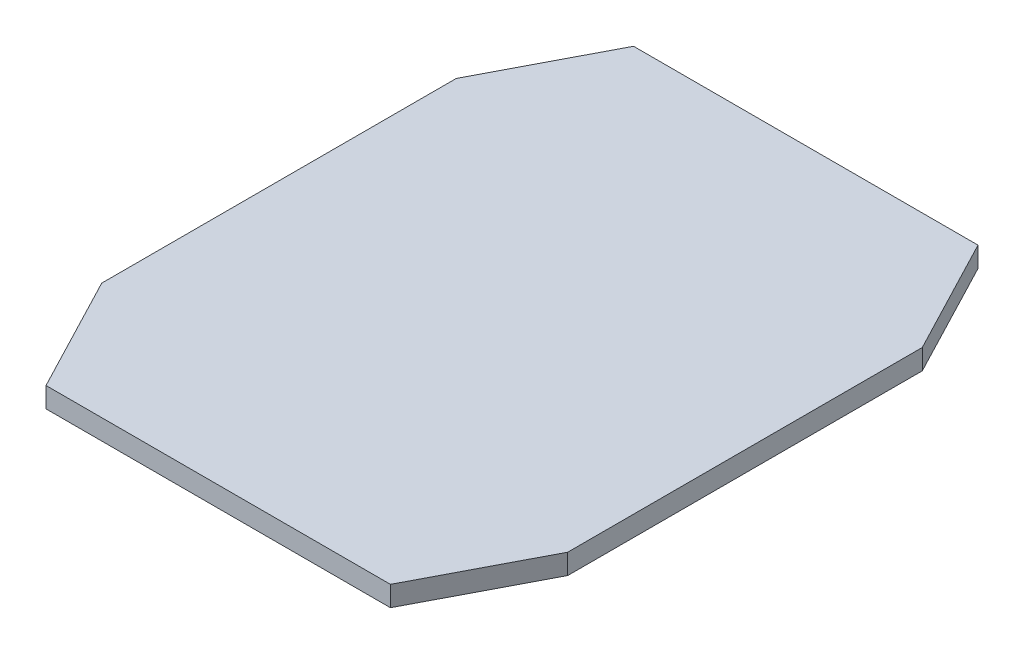
ISO-10303-21;
HEADER;
FILE_DESCRIPTION(('STEP AP214'),'2;1');
FILE_NAME('part.step','',(''),(''),'','','');
FILE_SCHEMA(('AUTOMOTIVE_DESIGN { 1 0 10303 214 1 1 1 1 }'));
ENDSEC;
DATA;
#1=APPLICATION_CONTEXT('core data for automotive mechanical design processes');
#2=APPLICATION_PROTOCOL_DEFINITION('international standard','automotive_design',2000,#1);
#3=PRODUCT_CONTEXT('',#1,'mechanical');
#4=PRODUCT('Part','Part','',(#3));
#5=PRODUCT_RELATED_PRODUCT_CATEGORY('part','',(#4));
#6=PRODUCT_DEFINITION_FORMATION('','',#4);
#7=PRODUCT_DEFINITION_CONTEXT('part definition',#1,'design');
#8=PRODUCT_DEFINITION('design','',#6,#7);
#9=PRODUCT_DEFINITION_SHAPE('','',#8);
#10=(LENGTH_UNIT() NAMED_UNIT(*) SI_UNIT(.MILLI.,.METRE.));
#11=(NAMED_UNIT(*) PLANE_ANGLE_UNIT() SI_UNIT($,.RADIAN.));
#12=(NAMED_UNIT(*) SI_UNIT($,.STERADIAN.) SOLID_ANGLE_UNIT());
#13=UNCERTAINTY_MEASURE_WITH_UNIT(LENGTH_MEASURE(1.E-05),#10,'distance_accuracy_value','');
#14=(GEOMETRIC_REPRESENTATION_CONTEXT(3) GLOBAL_UNCERTAINTY_ASSIGNED_CONTEXT((#13)) GLOBAL_UNIT_ASSIGNED_CONTEXT((#10,
#11,#12)) REPRESENTATION_CONTEXT('',''));
#15=CARTESIAN_POINT('',(0.,0.,0.));
#16=DIRECTION('',(0.,0.,1.));
#17=DIRECTION('',(1.,0.,0.));
#18=AXIS2_PLACEMENT_3D('',#15,#16,#17);
#19=CARTESIAN_POINT('',(-155.,10.,-145.));
#20=DIRECTION('',(0.,0.,1.));
#21=DIRECTION('',(1.,0.,0.));
#22=AXIS2_PLACEMENT_3D('',#19,#20,#21);
#23=PLANE('',#22);
#24=DIRECTION('',(-1.,0.,0.));
#25=VECTOR('',#24,1.);
#26=CARTESIAN_POINT('',(-155.,0.,-145.));
#27=LINE('',#26,#25);
#28=CARTESIAN_POINT('',(85.0000000049335,0.,-145.));
#29=VERTEX_POINT('',#28);
#30=CARTESIAN_POINT('',(-85.0000000049335,0.,-145.));
#31=VERTEX_POINT('',#30);
#32=EDGE_CURVE('E123',#29,#31,#27,.T.);
#33=ORIENTED_EDGE('',*,*,#32,.T.);
#34=DIRECTION('',(0.,1.,0.));
#35=VECTOR('',#34,1.);
#36=CARTESIAN_POINT('',(-85.0000000049335,0.,-145.));
#37=LINE('',#36,#35);
#38=CARTESIAN_POINT('',(-85.0000000049335,10.,-145.));
#39=VERTEX_POINT('',#38);
#40=EDGE_CURVE('E128',#31,#39,#37,.T.);
#41=ORIENTED_EDGE('',*,*,#40,.T.);
#42=DIRECTION('',(-1.,0.,0.));
#43=VECTOR('',#42,1.);
#44=CARTESIAN_POINT('',(-155.,10.,-145.));
#45=LINE('',#44,#43);
#46=CARTESIAN_POINT('',(85.0000000049335,10.,-145.));
#47=VERTEX_POINT('',#46);
#48=EDGE_CURVE('E46',#47,#39,#45,.T.);
#49=ORIENTED_EDGE('',*,*,#48,.F.);
#50=DIRECTION('',(0.,1.,0.));
#51=VECTOR('',#50,1.);
#52=CARTESIAN_POINT('',(85.0000000049335,0.,-145.));
#53=LINE('',#52,#51);
#54=EDGE_CURVE('E144',#29,#47,#53,.T.);
#55=ORIENTED_EDGE('',*,*,#54,.F.);
#56=EDGE_LOOP('',(#33,#41,#49,#55));
#57=FACE_BOUND('',#56,.T.);
#58=ADVANCED_FACE('F36',(#57),#23,.F.);
#59=CARTESIAN_POINT('',(-155.,10.,145.));
#60=DIRECTION('',(0.,0.,-1.));
#61=DIRECTION('',(-1.,0.,0.));
#62=AXIS2_PLACEMENT_3D('',#59,#60,#61);
#63=PLANE('',#62);
#64=DIRECTION('',(0.,1.,0.));
#65=VECTOR('',#64,1.);
#66=CARTESIAN_POINT('',(-85.,0.,145.));
#67=LINE('',#66,#65);
#68=CARTESIAN_POINT('',(-85.,0.,145.));
#69=VERTEX_POINT('',#68);
#70=CARTESIAN_POINT('',(-85.,10.,145.));
#71=VERTEX_POINT('',#70);
#72=EDGE_CURVE('E110',#69,#71,#67,.T.);
#73=ORIENTED_EDGE('',*,*,#72,.F.);
#74=DIRECTION('',(1.,0.,0.));
#75=VECTOR('',#74,1.);
#76=CARTESIAN_POINT('',(-155.,0.,145.));
#77=LINE('',#76,#75);
#78=CARTESIAN_POINT('',(85.,0.,145.));
#79=VERTEX_POINT('',#78);
#80=EDGE_CURVE('E41',#69,#79,#77,.T.);
#81=ORIENTED_EDGE('',*,*,#80,.T.);
#82=DIRECTION('',(0.,1.,0.));
#83=VECTOR('',#82,1.);
#84=CARTESIAN_POINT('',(85.,0.,145.));
#85=LINE('',#84,#83);
#86=CARTESIAN_POINT('',(85.,10.,145.));
#87=VERTEX_POINT('',#86);
#88=EDGE_CURVE('E152',#79,#87,#85,.T.);
#89=ORIENTED_EDGE('',*,*,#88,.T.);
#90=DIRECTION('',(1.,0.,0.));
#91=VECTOR('',#90,1.);
#92=CARTESIAN_POINT('',(-155.,10.,145.));
#93=LINE('',#92,#91);
#94=EDGE_CURVE('E11',#71,#87,#93,.T.);
#95=ORIENTED_EDGE('',*,*,#94,.F.);
#96=EDGE_LOOP('',(#73,#81,#89,#95));
#97=FACE_BOUND('',#96,.T.);
#98=ADVANCED_FACE('F119',(#97),#63,.F.);
#99=CARTESIAN_POINT('',(0.,10.,0.));
#100=DIRECTION('',(0.,1.,0.));
#101=DIRECTION('',(0.,0.,1.));
#102=AXIS2_PLACEMENT_3D('',#99,#100,#101);
#103=PLANE('',#102);
#104=DIRECTION('',(-0.462566006774816,0.,-0.886584846123822));
#105=VECTOR('',#104,1.);
#106=CARTESIAN_POINT('',(-115.000000005912,10.,87.5000000012872));
#107=LINE('',#106,#105);
#108=CARTESIAN_POINT('',(-115.000000005912,10.,87.5000000012872));
#109=VERTEX_POINT('',#108);
#110=EDGE_CURVE('E150',#71,#109,#107,.T.);
#111=ORIENTED_EDGE('',*,*,#110,.F.);
#112=ORIENTED_EDGE('',*,*,#94,.T.);
#113=DIRECTION('',(-0.462566006774816,0.,0.886584846123822));
#114=VECTOR('',#113,1.);
#115=CARTESIAN_POINT('',(115.000000005912,10.,87.5000000012872));
#116=LINE('',#115,#114);
#117=CARTESIAN_POINT('',(115.000000005912,10.,87.5000000012872));
#118=VERTEX_POINT('',#117);
#119=EDGE_CURVE('E139',#118,#87,#116,.T.);
#120=ORIENTED_EDGE('',*,*,#119,.F.);
#121=DIRECTION('',(0.,0.,1.));
#122=VECTOR('',#121,1.);
#123=CARTESIAN_POINT('',(115.000000005912,10.,-87.4999999987128));
#124=LINE('',#123,#122);
#125=CARTESIAN_POINT('',(115.000000005912,10.,-87.4999999987128));
#126=VERTEX_POINT('',#125);
#127=EDGE_CURVE('E148',#126,#118,#124,.T.);
#128=ORIENTED_EDGE('',*,*,#127,.F.);
#129=DIRECTION('',(0.462566006698744,0.,0.886584846163511));
#130=VECTOR('',#129,1.);
#131=CARTESIAN_POINT('',(85.0000000049335,10.,-145.));
#132=LINE('',#131,#130);
#133=EDGE_CURVE('E143',#47,#126,#132,.T.);
#134=ORIENTED_EDGE('',*,*,#133,.F.);
#135=ORIENTED_EDGE('',*,*,#48,.T.);
#136=DIRECTION('',(0.462566006698744,0.,-0.886584846163511));
#137=VECTOR('',#136,1.);
#138=CARTESIAN_POINT('',(-85.0000000049335,10.,-145.));
#139=LINE('',#138,#137);
#140=CARTESIAN_POINT('',(-115.000000005912,10.,-87.4999999987128));
#141=VERTEX_POINT('',#140);
#142=EDGE_CURVE('E114',#141,#39,#139,.T.);
#143=ORIENTED_EDGE('',*,*,#142,.F.);
#144=DIRECTION('',(0.,0.,-1.));
#145=VECTOR('',#144,1.);
#146=CARTESIAN_POINT('',(-115.000000005912,10.,-87.4999999987128));
#147=LINE('',#146,#145);
#148=EDGE_CURVE('E161',#109,#141,#147,.T.);
#149=ORIENTED_EDGE('',*,*,#148,.F.);
#150=EDGE_LOOP('',(#111,#112,#120,#128,#134,#135,#143,#149));
#151=FACE_BOUND('',#150,.T.);
#152=ADVANCED_FACE('F176',(#151),#103,.T.);
#153=CARTESIAN_POINT('',(0.,0.,0.));
#154=DIRECTION('',(0.,1.,0.));
#155=DIRECTION('',(0.,0.,1.));
#156=AXIS2_PLACEMENT_3D('',#153,#154,#155);
#157=PLANE('',#156);
#158=DIRECTION('',(0.,0.,-1.));
#159=VECTOR('',#158,1.);
#160=CARTESIAN_POINT('',(-115.000000005912,0.,-87.4999999987128));
#161=LINE('',#160,#159);
#162=CARTESIAN_POINT('',(-115.000000005912,0.,87.5000000012872));
#163=VERTEX_POINT('',#162);
#164=CARTESIAN_POINT('',(-115.000000005912,0.,-87.4999999987128));
#165=VERTEX_POINT('',#164);
#166=EDGE_CURVE('E112',#163,#165,#161,.T.);
#167=ORIENTED_EDGE('',*,*,#166,.T.);
#168=DIRECTION('',(0.462566006698744,0.,-0.886584846163511));
#169=VECTOR('',#168,1.);
#170=CARTESIAN_POINT('',(-85.0000000049335,0.,-145.));
#171=LINE('',#170,#169);
#172=EDGE_CURVE('E53',#165,#31,#171,.T.);
#173=ORIENTED_EDGE('',*,*,#172,.T.);
#174=ORIENTED_EDGE('',*,*,#32,.F.);
#175=DIRECTION('',(0.462566006698744,0.,0.886584846163511));
#176=VECTOR('',#175,1.);
#177=CARTESIAN_POINT('',(85.0000000049335,0.,-145.));
#178=LINE('',#177,#176);
#179=CARTESIAN_POINT('',(115.000000005912,0.,-87.4999999987128));
#180=VERTEX_POINT('',#179);
#181=EDGE_CURVE('E140',#29,#180,#178,.T.);
#182=ORIENTED_EDGE('',*,*,#181,.T.);
#183=DIRECTION('',(0.,0.,1.));
#184=VECTOR('',#183,1.);
#185=CARTESIAN_POINT('',(115.000000005912,0.,-87.4999999987128));
#186=LINE('',#185,#184);
#187=CARTESIAN_POINT('',(115.000000005912,0.,87.5000000012872));
#188=VERTEX_POINT('',#187);
#189=EDGE_CURVE('E142',#180,#188,#186,.T.);
#190=ORIENTED_EDGE('',*,*,#189,.T.);
#191=DIRECTION('',(-0.462566006774816,0.,0.886584846123822));
#192=VECTOR('',#191,1.);
#193=CARTESIAN_POINT('',(115.000000005912,0.,87.5000000012872));
#194=LINE('',#193,#192);
#195=EDGE_CURVE('E61',#188,#79,#194,.T.);
#196=ORIENTED_EDGE('',*,*,#195,.T.);
#197=ORIENTED_EDGE('',*,*,#80,.F.);
#198=DIRECTION('',(-0.462566006774816,0.,-0.886584846123822));
#199=VECTOR('',#198,1.);
#200=CARTESIAN_POINT('',(-115.000000005912,0.,87.5000000012872));
#201=LINE('',#200,#199);
#202=EDGE_CURVE('E101',#69,#163,#201,.T.);
#203=ORIENTED_EDGE('',*,*,#202,.T.);
#204=EDGE_LOOP('',(#167,#173,#174,#182,#190,#196,#197,#203));
#205=FACE_BOUND('',#204,.T.);
#206=ADVANCED_FACE('F124',(#205),#157,.F.);
#207=CARTESIAN_POINT('',(115.000000005912,0.,87.5000000012872));
#208=DIRECTION('',(-0.886584846123822,0.,-0.462566006774816));
#209=DIRECTION('',(-0.462566006774816,0.,0.886584846123822));
#210=AXIS2_PLACEMENT_3D('',#207,#208,#209);
#211=PLANE('',#210);
#212=ORIENTED_EDGE('',*,*,#119,.T.);
#213=ORIENTED_EDGE('',*,*,#88,.F.);
#214=ORIENTED_EDGE('',*,*,#195,.F.);
#215=DIRECTION('',(0.,1.,0.));
#216=VECTOR('',#215,1.);
#217=CARTESIAN_POINT('',(115.000000005912,0.,87.5000000012872));
#218=LINE('',#217,#216);
#219=EDGE_CURVE('E151',#188,#118,#218,.T.);
#220=ORIENTED_EDGE('',*,*,#219,.T.);
#221=EDGE_LOOP('',(#212,#213,#214,#220));
#222=FACE_BOUND('',#221,.T.);
#223=ADVANCED_FACE('F183',(#222),#211,.F.);
#224=CARTESIAN_POINT('',(115.000000005912,0.,-87.4999999987128));
#225=DIRECTION('',(-1.,0.,0.));
#226=DIRECTION('',(0.,0.,1.));
#227=AXIS2_PLACEMENT_3D('',#224,#225,#226);
#228=PLANE('',#227);
#229=ORIENTED_EDGE('',*,*,#127,.T.);
#230=ORIENTED_EDGE('',*,*,#219,.F.);
#231=ORIENTED_EDGE('',*,*,#189,.F.);
#232=DIRECTION('',(0.,1.,0.));
#233=VECTOR('',#232,1.);
#234=CARTESIAN_POINT('',(115.000000005912,0.,-87.4999999987128));
#235=LINE('',#234,#233);
#236=EDGE_CURVE('E159',#180,#126,#235,.T.);
#237=ORIENTED_EDGE('',*,*,#236,.T.);
#238=EDGE_LOOP('',(#229,#230,#231,#237));
#239=FACE_BOUND('',#238,.T.);
#240=ADVANCED_FACE('F182',(#239),#228,.F.);
#241=CARTESIAN_POINT('',(85.0000000049335,0.,-145.));
#242=DIRECTION('',(-0.886584846163512,0.,0.462566006698744));
#243=DIRECTION('',(0.462566006698744,0.,0.886584846163512));
#244=AXIS2_PLACEMENT_3D('',#241,#242,#243);
#245=PLANE('',#244);
#246=ORIENTED_EDGE('',*,*,#133,.T.);
#247=ORIENTED_EDGE('',*,*,#236,.F.);
#248=ORIENTED_EDGE('',*,*,#181,.F.);
#249=ORIENTED_EDGE('',*,*,#54,.T.);
#250=EDGE_LOOP('',(#246,#247,#248,#249));
#251=FACE_BOUND('',#250,.T.);
#252=ADVANCED_FACE('F179',(#251),#245,.F.);
#253=CARTESIAN_POINT('',(-85.0000000049335,0.,-145.));
#254=DIRECTION('',(0.886584846163512,0.,0.462566006698744));
#255=DIRECTION('',(0.462566006698744,0.,-0.886584846163512));
#256=AXIS2_PLACEMENT_3D('',#253,#254,#255);
#257=PLANE('',#256);
#258=ORIENTED_EDGE('',*,*,#142,.T.);
#259=ORIENTED_EDGE('',*,*,#40,.F.);
#260=ORIENTED_EDGE('',*,*,#172,.F.);
#261=DIRECTION('',(0.,1.,0.));
#262=VECTOR('',#261,1.);
#263=CARTESIAN_POINT('',(-115.000000005912,0.,-87.4999999987128));
#264=LINE('',#263,#262);
#265=EDGE_CURVE('E135',#165,#141,#264,.T.);
#266=ORIENTED_EDGE('',*,*,#265,.T.);
#267=EDGE_LOOP('',(#258,#259,#260,#266));
#268=FACE_BOUND('',#267,.T.);
#269=ADVANCED_FACE('F175',(#268),#257,.F.);
#270=CARTESIAN_POINT('',(-115.000000005912,0.,-87.4999999987128));
#271=DIRECTION('',(1.,0.,0.));
#272=DIRECTION('',(0.,0.,-1.));
#273=AXIS2_PLACEMENT_3D('',#270,#271,#272);
#274=PLANE('',#273);
#275=ORIENTED_EDGE('',*,*,#148,.T.);
#276=ORIENTED_EDGE('',*,*,#265,.F.);
#277=ORIENTED_EDGE('',*,*,#166,.F.);
#278=DIRECTION('',(0.,1.,0.));
#279=VECTOR('',#278,1.);
#280=CARTESIAN_POINT('',(-115.000000005912,0.,87.5000000012872));
#281=LINE('',#280,#279);
#282=EDGE_CURVE('E107',#163,#109,#281,.T.);
#283=ORIENTED_EDGE('',*,*,#282,.T.);
#284=EDGE_LOOP('',(#275,#276,#277,#283));
#285=FACE_BOUND('',#284,.T.);
#286=ADVANCED_FACE('F169',(#285),#274,.F.);
#287=CARTESIAN_POINT('',(-115.000000005912,0.,87.5000000012872));
#288=DIRECTION('',(0.886584846123822,0.,-0.462566006774816));
#289=DIRECTION('',(-0.462566006774816,0.,-0.886584846123822));
#290=AXIS2_PLACEMENT_3D('',#287,#288,#289);
#291=PLANE('',#290);
#292=ORIENTED_EDGE('',*,*,#110,.T.);
#293=ORIENTED_EDGE('',*,*,#282,.F.);
#294=ORIENTED_EDGE('',*,*,#202,.F.);
#295=ORIENTED_EDGE('',*,*,#72,.T.);
#296=EDGE_LOOP('',(#292,#293,#294,#295));
#297=FACE_BOUND('',#296,.T.);
#298=ADVANCED_FACE('F106',(#297),#291,.F.);
#299=CLOSED_SHELL('',(#58,#98,#152,#206,#223,#240,#252,#269,#286,#298));
#300=MANIFOLD_SOLID_BREP('B2',#299);
#301=ADVANCED_BREP_SHAPE_REPRESENTATION('',(#18,#300),#14);
#302=SHAPE_DEFINITION_REPRESENTATION(#9,#301);
ENDSEC;
END-ISO-10303-21;
